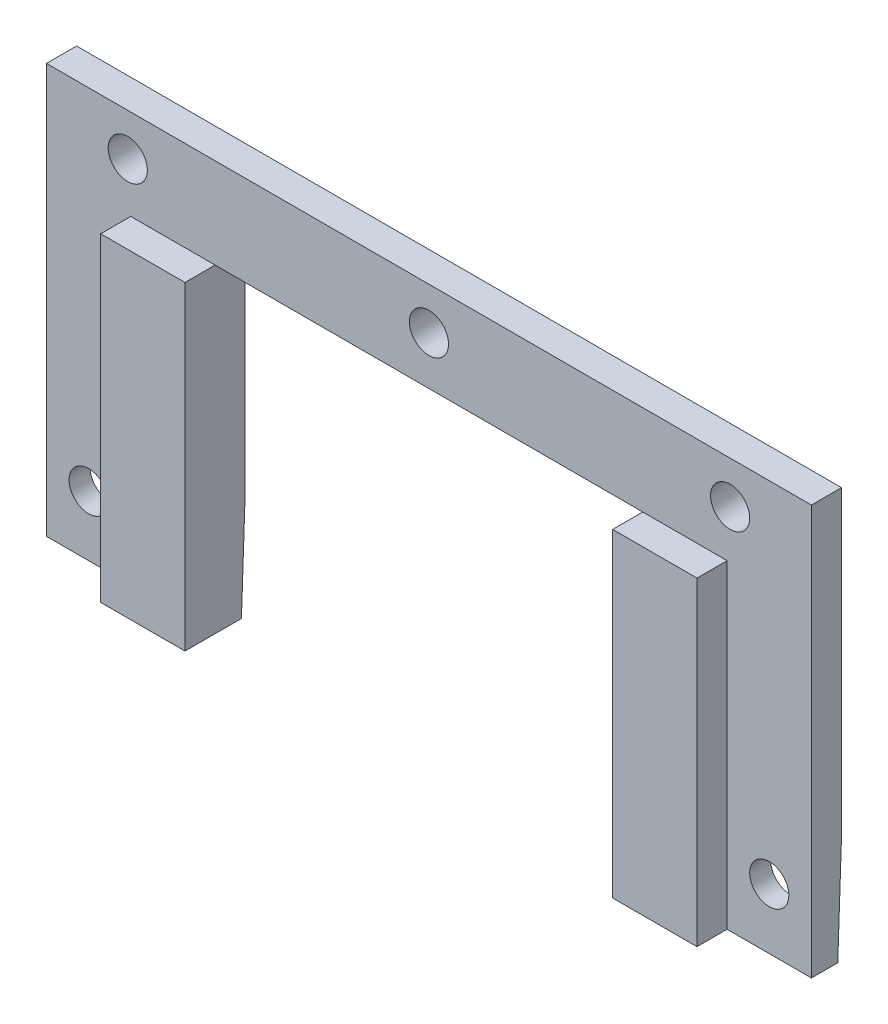
ISO-10303-21;
HEADER;
FILE_DESCRIPTION(('STEP AP214'),'2;1');
FILE_NAME('part.step','',(''),(''),'','','');
FILE_SCHEMA(('AUTOMOTIVE_DESIGN { 1 0 10303 214 1 1 1 1 }'));
ENDSEC;
DATA;
#1=APPLICATION_CONTEXT('core data for automotive mechanical design processes');
#2=APPLICATION_PROTOCOL_DEFINITION('international standard','automotive_design',2000,#1);
#3=PRODUCT_CONTEXT('',#1,'mechanical');
#4=PRODUCT('Part','Part','',(#3));
#5=PRODUCT_RELATED_PRODUCT_CATEGORY('part','',(#4));
#6=PRODUCT_DEFINITION_FORMATION('','',#4);
#7=PRODUCT_DEFINITION_CONTEXT('part definition',#1,'design');
#8=PRODUCT_DEFINITION('design','',#6,#7);
#9=PRODUCT_DEFINITION_SHAPE('','',#8);
#10=(LENGTH_UNIT() NAMED_UNIT(*) SI_UNIT(.MILLI.,.METRE.));
#11=(NAMED_UNIT(*) PLANE_ANGLE_UNIT() SI_UNIT($,.RADIAN.));
#12=(NAMED_UNIT(*) SI_UNIT($,.STERADIAN.) SOLID_ANGLE_UNIT());
#13=UNCERTAINTY_MEASURE_WITH_UNIT(LENGTH_MEASURE(1.E-05),#10,'distance_accuracy_value','');
#14=(GEOMETRIC_REPRESENTATION_CONTEXT(3) GLOBAL_UNCERTAINTY_ASSIGNED_CONTEXT((#13)) GLOBAL_UNIT_ASSIGNED_CONTEXT((#10,
#11,#12)) REPRESENTATION_CONTEXT('',''));
#15=CARTESIAN_POINT('',(0.,0.,0.));
#16=DIRECTION('',(0.,0.,1.));
#17=DIRECTION('',(1.,0.,0.));
#18=AXIS2_PLACEMENT_3D('',#15,#16,#17);
#19=CARTESIAN_POINT('',(0.,0.,5.));
#20=DIRECTION('',(0.,0.,-1.));
#21=DIRECTION('',(-1.,0.,0.));
#22=AXIS2_PLACEMENT_3D('',#19,#20,#21);
#23=PLANE('',#22);
#24=CARTESIAN_POINT('',(56.5,57.,5.));
#25=DIRECTION('',(0.,0.,-1.));
#26=DIRECTION('',(-1.,0.,0.));
#27=AXIS2_PLACEMENT_3D('',#24,#25,#26);
#28=CIRCLE('',#27,3.25);
#29=CARTESIAN_POINT('',(53.25,57.,5.));
#30=VERTEX_POINT('',#29);
#31=EDGE_CURVE('E190',#30,#30,#28,.F.);
#32=ORIENTED_EDGE('',*,*,#31,.F.);
#33=EDGE_LOOP('',(#32));
#34=FACE_BOUND('',#33,.T.);
#35=CARTESIAN_POINT('',(-56.5,57.,5.));
#36=DIRECTION('',(0.,0.,-1.));
#37=DIRECTION('',(-1.,0.,0.));
#38=AXIS2_PLACEMENT_3D('',#35,#36,#37);
#39=CIRCLE('',#38,3.25);
#40=CARTESIAN_POINT('',(-59.75,57.,5.));
#41=VERTEX_POINT('',#40);
#42=EDGE_CURVE('E182',#41,#41,#39,.F.);
#43=ORIENTED_EDGE('',*,*,#42,.F.);
#44=EDGE_LOOP('',(#43));
#45=FACE_BOUND('',#44,.T.);
#46=CARTESIAN_POINT('',(0.,108.,5.));
#47=DIRECTION('',(0.,0.,1.));
#48=DIRECTION('',(1.,0.,0.));
#49=AXIS2_PLACEMENT_3D('',#46,#47,#48);
#50=CIRCLE('',#49,3.25);
#51=CARTESIAN_POINT('',(3.25,108.,5.));
#52=VERTEX_POINT('',#51);
#53=EDGE_CURVE('E269',#52,#52,#50,.T.);
#54=ORIENTED_EDGE('',*,*,#53,.F.);
#55=EDGE_LOOP('',(#54));
#56=FACE_BOUND('',#55,.T.);
#57=CARTESIAN_POINT('',(-50.,108.,5.));
#58=DIRECTION('',(0.,0.,1.));
#59=DIRECTION('',(1.,0.,0.));
#60=AXIS2_PLACEMENT_3D('',#57,#58,#59);
#61=CIRCLE('',#60,3.25);
#62=CARTESIAN_POINT('',(-46.75,108.,5.));
#63=VERTEX_POINT('',#62);
#64=EDGE_CURVE('E263',#63,#63,#61,.T.);
#65=ORIENTED_EDGE('',*,*,#64,.F.);
#66=EDGE_LOOP('',(#65));
#67=FACE_BOUND('',#66,.T.);
#68=CARTESIAN_POINT('',(50.,108.,5.));
#69=DIRECTION('',(0.,0.,1.));
#70=DIRECTION('',(1.,0.,0.));
#71=AXIS2_PLACEMENT_3D('',#68,#69,#70);
#72=CIRCLE('',#71,3.25);
#73=CARTESIAN_POINT('',(53.25,108.,5.));
#74=VERTEX_POINT('',#73);
#75=EDGE_CURVE('E257',#74,#74,#72,.T.);
#76=ORIENTED_EDGE('',*,*,#75,.F.);
#77=EDGE_LOOP('',(#76));
#78=FACE_BOUND('',#77,.T.);
#79=DIRECTION('',(0.,1.,0.));
#80=VECTOR('',#79,1.);
#81=CARTESIAN_POINT('',(49.5,47.,5.));
#82=LINE('',#81,#80);
#83=CARTESIAN_POINT('',(49.5,47.,5.));
#84=VERTEX_POINT('',#83);
#85=CARTESIAN_POINT('',(49.5,100.,5.));
#86=VERTEX_POINT('',#85);
#87=EDGE_CURVE('E207',#84,#86,#82,.T.);
#88=ORIENTED_EDGE('',*,*,#87,.F.);
#89=DIRECTION('',(1.,0.,0.));
#90=VECTOR('',#89,1.);
#91=CARTESIAN_POINT('',(63.5,47.,5.));
#92=LINE('',#91,#90);
#93=CARTESIAN_POINT('',(63.5,47.,5.));
#94=VERTEX_POINT('',#93);
#95=EDGE_CURVE('E280',#84,#94,#92,.T.);
#96=ORIENTED_EDGE('',*,*,#95,.T.);
#97=DIRECTION('',(0.,1.,0.));
#98=VECTOR('',#97,1.);
#99=CARTESIAN_POINT('',(63.5,115.,5.));
#100=LINE('',#99,#98);
#101=CARTESIAN_POINT('',(63.5,115.,5.));
#102=VERTEX_POINT('',#101);
#103=EDGE_CURVE('E161',#94,#102,#100,.T.);
#104=ORIENTED_EDGE('',*,*,#103,.T.);
#105=DIRECTION('',(-1.,0.,0.));
#106=VECTOR('',#105,1.);
#107=CARTESIAN_POINT('',(-63.5,115.,5.));
#108=LINE('',#107,#106);
#109=CARTESIAN_POINT('',(-63.5,115.,5.));
#110=VERTEX_POINT('',#109);
#111=EDGE_CURVE('E283',#102,#110,#108,.T.);
#112=ORIENTED_EDGE('',*,*,#111,.T.);
#113=DIRECTION('',(0.,-1.,0.));
#114=VECTOR('',#113,1.);
#115=CARTESIAN_POINT('',(-63.5,47.,5.));
#116=LINE('',#115,#114);
#117=CARTESIAN_POINT('',(-63.5,47.,5.));
#118=VERTEX_POINT('',#117);
#119=EDGE_CURVE('E285',#110,#118,#116,.T.);
#120=ORIENTED_EDGE('',*,*,#119,.T.);
#121=DIRECTION('',(1.,0.,0.));
#122=VECTOR('',#121,1.);
#123=CARTESIAN_POINT('',(-35.5,47.,5.));
#124=LINE('',#123,#122);
#125=CARTESIAN_POINT('',(-49.5,47.,5.));
#126=VERTEX_POINT('',#125);
#127=EDGE_CURVE('E275',#118,#126,#124,.T.);
#128=ORIENTED_EDGE('',*,*,#127,.T.);
#129=DIRECTION('',(0.,-1.,0.));
#130=VECTOR('',#129,1.);
#131=CARTESIAN_POINT('',(-49.5,47.,5.));
#132=LINE('',#131,#130);
#133=CARTESIAN_POINT('',(-49.5,100.,5.));
#134=VERTEX_POINT('',#133);
#135=EDGE_CURVE('E231',#134,#126,#132,.T.);
#136=ORIENTED_EDGE('',*,*,#135,.F.);
#137=DIRECTION('',(-1.,0.,0.));
#138=VECTOR('',#137,1.);
#139=CARTESIAN_POINT('',(-49.5,100.,5.));
#140=LINE('',#139,#138);
#141=CARTESIAN_POINT('',(-35.5,100.,5.));
#142=VERTEX_POINT('',#141);
#143=EDGE_CURVE('E236',#142,#134,#140,.T.);
#144=ORIENTED_EDGE('',*,*,#143,.F.);
#145=DIRECTION('',(1.,0.,0.));
#146=VECTOR('',#145,1.);
#147=CARTESIAN_POINT('',(35.5,100.,5.));
#148=LINE('',#147,#146);
#149=CARTESIAN_POINT('',(35.5,100.,5.));
#150=VERTEX_POINT('',#149);
#151=EDGE_CURVE('E277',#142,#150,#148,.T.);
#152=ORIENTED_EDGE('',*,*,#151,.T.);
#153=DIRECTION('',(-1.,0.,0.));
#154=VECTOR('',#153,1.);
#155=CARTESIAN_POINT('',(35.5,100.,5.));
#156=LINE('',#155,#154);
#157=EDGE_CURVE('E212',#86,#150,#156,.T.);
#158=ORIENTED_EDGE('',*,*,#157,.F.);
#159=EDGE_LOOP('',(#88,#96,#104,#112,#120,#128,#136,#144,#152,#158));
#160=FACE_BOUND('',#159,.T.);
#161=ADVANCED_FACE('F33',(#34,#45,#56,#67,#78,#160),#23,.F.);
#162=CARTESIAN_POINT('',(0.,0.,0.));
#163=DIRECTION('',(0.,0.,-1.));
#164=DIRECTION('',(-1.,0.,0.));
#165=AXIS2_PLACEMENT_3D('',#162,#163,#164);
#166=PLANE('',#165);
#167=DIRECTION('',(1.,0.,0.));
#168=VECTOR('',#167,1.);
#169=CARTESIAN_POINT('',(-63.5,65.,0.));
#170=LINE('',#169,#168);
#171=CARTESIAN_POINT('',(-63.5,65.,0.));
#172=VERTEX_POINT('',#171);
#173=CARTESIAN_POINT('',(-35.5,65.,0.));
#174=VERTEX_POINT('',#173);
#175=EDGE_CURVE('E200',#172,#174,#170,.T.);
#176=ORIENTED_EDGE('',*,*,#175,.F.);
#177=DIRECTION('',(0.,-1.,0.));
#178=VECTOR('',#177,1.);
#179=CARTESIAN_POINT('',(-63.5,47.,0.));
#180=LINE('',#179,#178);
#181=CARTESIAN_POINT('',(-63.5,115.,0.));
#182=VERTEX_POINT('',#181);
#183=EDGE_CURVE('E278',#182,#172,#180,.T.);
#184=ORIENTED_EDGE('',*,*,#183,.F.);
#185=DIRECTION('',(-1.,0.,0.));
#186=VECTOR('',#185,1.);
#187=CARTESIAN_POINT('',(-63.5,115.,0.));
#188=LINE('',#187,#186);
#189=CARTESIAN_POINT('',(63.5,115.,0.));
#190=VERTEX_POINT('',#189);
#191=EDGE_CURVE('E296',#190,#182,#188,.T.);
#192=ORIENTED_EDGE('',*,*,#191,.F.);
#193=DIRECTION('',(0.,1.,0.));
#194=VECTOR('',#193,1.);
#195=CARTESIAN_POINT('',(63.5,115.,0.));
#196=LINE('',#195,#194);
#197=CARTESIAN_POINT('',(63.5,65.,0.));
#198=VERTEX_POINT('',#197);
#199=EDGE_CURVE('E294',#198,#190,#196,.T.);
#200=ORIENTED_EDGE('',*,*,#199,.F.);
#201=CARTESIAN_POINT('',(35.5,65.,0.));
#202=VERTEX_POINT('',#201);
#203=EDGE_CURVE('E50',#202,#198,#170,.T.);
#204=ORIENTED_EDGE('',*,*,#203,.F.);
#205=DIRECTION('',(0.,-1.,0.));
#206=VECTOR('',#205,1.);
#207=CARTESIAN_POINT('',(35.5,47.,0.));
#208=LINE('',#207,#206);
#209=CARTESIAN_POINT('',(35.5,100.,0.));
#210=VERTEX_POINT('',#209);
#211=EDGE_CURVE('E291',#210,#202,#208,.T.);
#212=ORIENTED_EDGE('',*,*,#211,.F.);
#213=DIRECTION('',(1.,0.,0.));
#214=VECTOR('',#213,1.);
#215=CARTESIAN_POINT('',(35.5,100.,0.));
#216=LINE('',#215,#214);
#217=CARTESIAN_POINT('',(-35.5,100.,0.));
#218=VERTEX_POINT('',#217);
#219=EDGE_CURVE('E289',#218,#210,#216,.T.);
#220=ORIENTED_EDGE('',*,*,#219,.F.);
#221=DIRECTION('',(0.,1.,0.));
#222=VECTOR('',#221,1.);
#223=CARTESIAN_POINT('',(-35.5,100.,0.));
#224=LINE('',#223,#222);
#225=EDGE_CURVE('E272',#174,#218,#224,.T.);
#226=ORIENTED_EDGE('',*,*,#225,.F.);
#227=EDGE_LOOP('',(#176,#184,#192,#200,#204,#212,#220,#226));
#228=FACE_BOUND('',#227,.T.);
#229=CARTESIAN_POINT('',(-50.,108.,0.));
#230=DIRECTION('',(0.,0.,1.));
#231=DIRECTION('',(1.,0.,0.));
#232=AXIS2_PLACEMENT_3D('',#229,#230,#231);
#233=CIRCLE('',#232,3.25);
#234=CARTESIAN_POINT('',(-46.75,108.,0.));
#235=VERTEX_POINT('',#234);
#236=EDGE_CURVE('E260',#235,#235,#233,.T.);
#237=ORIENTED_EDGE('',*,*,#236,.T.);
#238=EDGE_LOOP('',(#237));
#239=FACE_BOUND('',#238,.T.);
#240=CARTESIAN_POINT('',(0.,108.,0.));
#241=DIRECTION('',(0.,0.,1.));
#242=DIRECTION('',(1.,0.,0.));
#243=AXIS2_PLACEMENT_3D('',#240,#241,#242);
#244=CIRCLE('',#243,3.25);
#245=CARTESIAN_POINT('',(3.25,108.,0.));
#246=VERTEX_POINT('',#245);
#247=EDGE_CURVE('E266',#246,#246,#244,.T.);
#248=ORIENTED_EDGE('',*,*,#247,.T.);
#249=EDGE_LOOP('',(#248));
#250=FACE_BOUND('',#249,.T.);
#251=CARTESIAN_POINT('',(50.,108.,0.));
#252=DIRECTION('',(0.,0.,1.));
#253=DIRECTION('',(1.,0.,0.));
#254=AXIS2_PLACEMENT_3D('',#251,#252,#253);
#255=CIRCLE('',#254,3.25);
#256=CARTESIAN_POINT('',(53.25,108.,0.));
#257=VERTEX_POINT('',#256);
#258=EDGE_CURVE('E256',#257,#257,#255,.T.);
#259=ORIENTED_EDGE('',*,*,#258,.T.);
#260=EDGE_LOOP('',(#259));
#261=FACE_BOUND('',#260,.T.);
#262=ADVANCED_FACE('F313',(#228,#239,#250,#261),#166,.T.);
#263=CARTESIAN_POINT('',(-35.5,47.,5.));
#264=DIRECTION('',(0.,1.,0.));
#265=DIRECTION('',(0.,0.,1.));
#266=AXIS2_PLACEMENT_3D('',#263,#264,#265);
#267=PLANE('',#266);
#268=DIRECTION('',(0.,0.,-1.));
#269=VECTOR('',#268,1.);
#270=CARTESIAN_POINT('',(-63.5,47.,5.));
#271=LINE('',#270,#269);
#272=CARTESIAN_POINT('',(-63.5,47.,0.628573850851329));
#273=VERTEX_POINT('',#272);
#274=EDGE_CURVE('E287',#118,#273,#271,.T.);
#275=ORIENTED_EDGE('',*,*,#274,.T.);
#276=DIRECTION('',(1.,0.,0.));
#277=VECTOR('',#276,1.);
#278=CARTESIAN_POINT('',(-63.5,47.,0.628573850851329));
#279=LINE('',#278,#277);
#280=CARTESIAN_POINT('',(-35.5,47.,0.628573850851329));
#281=VERTEX_POINT('',#280);
#282=EDGE_CURVE('E58',#273,#281,#279,.T.);
#283=ORIENTED_EDGE('',*,*,#282,.T.);
#284=DIRECTION('',(0.,0.,-1.));
#285=VECTOR('',#284,1.);
#286=CARTESIAN_POINT('',(-35.5,47.,5.));
#287=LINE('',#286,#285);
#288=CARTESIAN_POINT('',(-35.5,47.,10.));
#289=VERTEX_POINT('',#288);
#290=EDGE_CURVE('E11',#289,#281,#287,.T.);
#291=ORIENTED_EDGE('',*,*,#290,.F.);
#292=DIRECTION('',(1.,0.,0.));
#293=VECTOR('',#292,1.);
#294=CARTESIAN_POINT('',(-49.5,47.,10.));
#295=LINE('',#294,#293);
#296=CARTESIAN_POINT('',(-49.5,47.,10.));
#297=VERTEX_POINT('',#296);
#298=EDGE_CURVE('E235',#297,#289,#295,.T.);
#299=ORIENTED_EDGE('',*,*,#298,.F.);
#300=DIRECTION('',(0.,0.,-1.));
#301=VECTOR('',#300,1.);
#302=CARTESIAN_POINT('',(-49.5,47.,10.));
#303=LINE('',#302,#301);
#304=EDGE_CURVE('E253',#297,#126,#303,.T.);
#305=ORIENTED_EDGE('',*,*,#304,.T.);
#306=ORIENTED_EDGE('',*,*,#127,.F.);
#307=EDGE_LOOP('',(#275,#283,#291,#299,#305,#306));
#308=FACE_BOUND('',#307,.T.);
#309=ADVANCED_FACE('F35',(#308),#267,.F.);
#310=CARTESIAN_POINT('',(-35.5,100.,5.));
#311=DIRECTION('',(-1.,0.,0.));
#312=DIRECTION('',(0.,-1.,0.));
#313=AXIS2_PLACEMENT_3D('',#310,#311,#312);
#314=PLANE('',#313);
#315=ORIENTED_EDGE('',*,*,#290,.T.);
#316=DIRECTION('',(0.,0.999390827019096,-0.0348994967024938));
#317=VECTOR('',#316,1.);
#318=CARTESIAN_POINT('',(-35.5,99.7829796951867,-1.2146484161715));
#319=LINE('',#318,#317);
#320=EDGE_CURVE('E204',#281,#174,#319,.T.);
#321=ORIENTED_EDGE('',*,*,#320,.T.);
#322=ORIENTED_EDGE('',*,*,#225,.T.);
#323=DIRECTION('',(0.,0.,-1.));
#324=VECTOR('',#323,1.);
#325=CARTESIAN_POINT('',(-35.5,100.,5.));
#326=LINE('',#325,#324);
#327=EDGE_CURVE('E42',#142,#218,#326,.T.);
#328=ORIENTED_EDGE('',*,*,#327,.F.);
#329=DIRECTION('',(0.,0.,-1.));
#330=VECTOR('',#329,1.);
#331=CARTESIAN_POINT('',(-35.5,100.,10.));
#332=LINE('',#331,#330);
#333=CARTESIAN_POINT('',(-35.5,100.,10.));
#334=VERTEX_POINT('',#333);
#335=EDGE_CURVE('E250',#334,#142,#332,.T.);
#336=ORIENTED_EDGE('',*,*,#335,.F.);
#337=DIRECTION('',(0.,1.,0.));
#338=VECTOR('',#337,1.);
#339=CARTESIAN_POINT('',(-35.5,47.,10.));
#340=LINE('',#339,#338);
#341=EDGE_CURVE('E239',#289,#334,#340,.T.);
#342=ORIENTED_EDGE('',*,*,#341,.F.);
#343=EDGE_LOOP('',(#315,#321,#322,#328,#336,#342));
#344=FACE_BOUND('',#343,.T.);
#345=ADVANCED_FACE('F319',(#344),#314,.F.);
#346=CARTESIAN_POINT('',(35.5,100.,5.));
#347=DIRECTION('',(0.,1.,0.));
#348=DIRECTION('',(0.,0.,1.));
#349=AXIS2_PLACEMENT_3D('',#346,#347,#348);
#350=PLANE('',#349);
#351=ORIENTED_EDGE('',*,*,#219,.T.);
#352=DIRECTION('',(0.,0.,-1.));
#353=VECTOR('',#352,1.);
#354=CARTESIAN_POINT('',(35.5,100.,5.));
#355=LINE('',#354,#353);
#356=EDGE_CURVE('E164',#150,#210,#355,.T.);
#357=ORIENTED_EDGE('',*,*,#356,.F.);
#358=ORIENTED_EDGE('',*,*,#151,.F.);
#359=ORIENTED_EDGE('',*,*,#327,.T.);
#360=EDGE_LOOP('',(#351,#357,#358,#359));
#361=FACE_BOUND('',#360,.T.);
#362=ADVANCED_FACE('F344',(#361),#350,.F.);
#363=CARTESIAN_POINT('',(35.5,47.,5.));
#364=DIRECTION('',(1.,0.,0.));
#365=DIRECTION('',(0.,1.,0.));
#366=AXIS2_PLACEMENT_3D('',#363,#364,#365);
#367=PLANE('',#366);
#368=ORIENTED_EDGE('',*,*,#211,.T.);
#369=DIRECTION('',(0.,-0.999390827019096,0.0348994967024938));
#370=VECTOR('',#369,1.);
#371=CARTESIAN_POINT('',(35.5,46.8475323633013,0.633898138047435));
#372=LINE('',#371,#370);
#373=CARTESIAN_POINT('',(35.5,47.,0.628573850851329));
#374=VERTEX_POINT('',#373);
#375=EDGE_CURVE('E201',#202,#374,#372,.T.);
#376=ORIENTED_EDGE('',*,*,#375,.T.);
#377=DIRECTION('',(0.,0.,-1.));
#378=VECTOR('',#377,1.);
#379=CARTESIAN_POINT('',(35.5,47.,5.));
#380=LINE('',#379,#378);
#381=CARTESIAN_POINT('',(35.5,47.,10.));
#382=VERTEX_POINT('',#381);
#383=EDGE_CURVE('E157',#382,#374,#380,.T.);
#384=ORIENTED_EDGE('',*,*,#383,.F.);
#385=DIRECTION('',(0.,-1.,0.));
#386=VECTOR('',#385,1.);
#387=CARTESIAN_POINT('',(35.5,47.,10.));
#388=LINE('',#387,#386);
#389=CARTESIAN_POINT('',(35.5,100.,10.));
#390=VERTEX_POINT('',#389);
#391=EDGE_CURVE('E208',#390,#382,#388,.T.);
#392=ORIENTED_EDGE('',*,*,#391,.F.);
#393=DIRECTION('',(0.,0.,-1.));
#394=VECTOR('',#393,1.);
#395=CARTESIAN_POINT('',(35.5,100.,10.));
#396=LINE('',#395,#394);
#397=EDGE_CURVE('E218',#390,#150,#396,.T.);
#398=ORIENTED_EDGE('',*,*,#397,.T.);
#399=ORIENTED_EDGE('',*,*,#356,.T.);
#400=EDGE_LOOP('',(#368,#376,#384,#392,#398,#399));
#401=FACE_BOUND('',#400,.T.);
#402=ADVANCED_FACE('F338',(#401),#367,.F.);
#403=CARTESIAN_POINT('',(63.5,47.,5.));
#404=DIRECTION('',(0.,1.,0.));
#405=DIRECTION('',(0.,0.,1.));
#406=AXIS2_PLACEMENT_3D('',#403,#404,#405);
#407=PLANE('',#406);
#408=ORIENTED_EDGE('',*,*,#383,.T.);
#409=CARTESIAN_POINT('',(63.5,47.,0.628573850851329));
#410=VERTEX_POINT('',#409);
#411=EDGE_CURVE('E142',#374,#410,#279,.T.);
#412=ORIENTED_EDGE('',*,*,#411,.T.);
#413=DIRECTION('',(0.,0.,-1.));
#414=VECTOR('',#413,1.);
#415=CARTESIAN_POINT('',(63.5,47.,5.));
#416=LINE('',#415,#414);
#417=EDGE_CURVE('E154',#94,#410,#416,.T.);
#418=ORIENTED_EDGE('',*,*,#417,.F.);
#419=ORIENTED_EDGE('',*,*,#95,.F.);
#420=DIRECTION('',(0.,0.,-1.));
#421=VECTOR('',#420,1.);
#422=CARTESIAN_POINT('',(49.5,47.,10.));
#423=LINE('',#422,#421);
#424=CARTESIAN_POINT('',(49.5,47.,10.));
#425=VERTEX_POINT('',#424);
#426=EDGE_CURVE('E228',#425,#84,#423,.T.);
#427=ORIENTED_EDGE('',*,*,#426,.F.);
#428=DIRECTION('',(1.,0.,0.));
#429=VECTOR('',#428,1.);
#430=CARTESIAN_POINT('',(35.5,47.,10.));
#431=LINE('',#430,#429);
#432=EDGE_CURVE('E211',#382,#425,#431,.T.);
#433=ORIENTED_EDGE('',*,*,#432,.F.);
#434=EDGE_LOOP('',(#408,#412,#418,#419,#427,#433));
#435=FACE_BOUND('',#434,.T.);
#436=ADVANCED_FACE('F153',(#435),#407,.F.);
#437=CARTESIAN_POINT('',(63.5,115.,5.));
#438=DIRECTION('',(-1.,0.,0.));
#439=DIRECTION('',(0.,0.,1.));
#440=AXIS2_PLACEMENT_3D('',#437,#438,#439);
#441=PLANE('',#440);
#442=ORIENTED_EDGE('',*,*,#417,.T.);
#443=DIRECTION('',(0.,-0.999390827019096,0.0348994967024938));
#444=VECTOR('',#443,1.);
#445=CARTESIAN_POINT('',(63.5,65.,0.));
#446=LINE('',#445,#444);
#447=EDGE_CURVE('E139',#198,#410,#446,.T.);
#448=ORIENTED_EDGE('',*,*,#447,.F.);
#449=ORIENTED_EDGE('',*,*,#199,.T.);
#450=DIRECTION('',(0.,0.,-1.));
#451=VECTOR('',#450,1.);
#452=CARTESIAN_POINT('',(63.5,115.,5.));
#453=LINE('',#452,#451);
#454=EDGE_CURVE('E162',#102,#190,#453,.T.);
#455=ORIENTED_EDGE('',*,*,#454,.F.);
#456=ORIENTED_EDGE('',*,*,#103,.F.);
#457=EDGE_LOOP('',(#442,#448,#449,#455,#456));
#458=FACE_BOUND('',#457,.T.);
#459=ADVANCED_FACE('F159',(#458),#441,.F.);
#460=CARTESIAN_POINT('',(-63.5,115.,5.));
#461=DIRECTION('',(0.,-1.,0.));
#462=DIRECTION('',(0.,0.,-1.));
#463=AXIS2_PLACEMENT_3D('',#460,#461,#462);
#464=PLANE('',#463);
#465=ORIENTED_EDGE('',*,*,#191,.T.);
#466=DIRECTION('',(0.,0.,-1.));
#467=VECTOR('',#466,1.);
#468=CARTESIAN_POINT('',(-63.5,115.,5.));
#469=LINE('',#468,#467);
#470=EDGE_CURVE('E167',#110,#182,#469,.T.);
#471=ORIENTED_EDGE('',*,*,#470,.F.);
#472=ORIENTED_EDGE('',*,*,#111,.F.);
#473=ORIENTED_EDGE('',*,*,#454,.T.);
#474=EDGE_LOOP('',(#465,#471,#472,#473));
#475=FACE_BOUND('',#474,.T.);
#476=ADVANCED_FACE('F335',(#475),#464,.F.);
#477=CARTESIAN_POINT('',(-63.5,47.,5.));
#478=DIRECTION('',(1.,0.,0.));
#479=DIRECTION('',(0.,0.,-1.));
#480=AXIS2_PLACEMENT_3D('',#477,#478,#479);
#481=PLANE('',#480);
#482=ORIENTED_EDGE('',*,*,#183,.T.);
#483=DIRECTION('',(0.,-0.999390827019096,0.0348994967024938));
#484=VECTOR('',#483,1.);
#485=CARTESIAN_POINT('',(-63.5,65.,0.));
#486=LINE('',#485,#484);
#487=EDGE_CURVE('E147',#172,#273,#486,.T.);
#488=ORIENTED_EDGE('',*,*,#487,.T.);
#489=ORIENTED_EDGE('',*,*,#274,.F.);
#490=ORIENTED_EDGE('',*,*,#119,.F.);
#491=ORIENTED_EDGE('',*,*,#470,.T.);
#492=EDGE_LOOP('',(#482,#488,#489,#490,#491));
#493=FACE_BOUND('',#492,.T.);
#494=ADVANCED_FACE('F306',(#493),#481,.F.);
#495=CARTESIAN_POINT('',(0.,108.,5.));
#496=DIRECTION('',(0.,0.,-1.));
#497=DIRECTION('',(-1.,0.,0.));
#498=AXIS2_PLACEMENT_3D('',#495,#496,#497);
#499=CYLINDRICAL_SURFACE('',#498,3.25);
#500=ORIENTED_EDGE('',*,*,#53,.T.);
#501=EDGE_LOOP('',(#500));
#502=FACE_BOUND('',#501,.T.);
#503=ORIENTED_EDGE('',*,*,#247,.F.);
#504=EDGE_LOOP('',(#503));
#505=FACE_BOUND('',#504,.T.);
#506=ADVANCED_FACE('F374',(#502,#505),#499,.F.);
#507=CARTESIAN_POINT('',(-50.,108.,5.));
#508=DIRECTION('',(0.,0.,-1.));
#509=DIRECTION('',(-1.,0.,0.));
#510=AXIS2_PLACEMENT_3D('',#507,#508,#509);
#511=CYLINDRICAL_SURFACE('',#510,3.25);
#512=ORIENTED_EDGE('',*,*,#64,.T.);
#513=EDGE_LOOP('',(#512));
#514=FACE_BOUND('',#513,.T.);
#515=ORIENTED_EDGE('',*,*,#236,.F.);
#516=EDGE_LOOP('',(#515));
#517=FACE_BOUND('',#516,.T.);
#518=ADVANCED_FACE('F463',(#514,#517),#511,.F.);
#519=CARTESIAN_POINT('',(50.,108.,5.));
#520=DIRECTION('',(0.,0.,-1.));
#521=DIRECTION('',(-1.,0.,0.));
#522=AXIS2_PLACEMENT_3D('',#519,#520,#521);
#523=CYLINDRICAL_SURFACE('',#522,3.25);
#524=ORIENTED_EDGE('',*,*,#75,.T.);
#525=EDGE_LOOP('',(#524));
#526=FACE_BOUND('',#525,.T.);
#527=ORIENTED_EDGE('',*,*,#258,.F.);
#528=EDGE_LOOP('',(#527));
#529=FACE_BOUND('',#528,.T.);
#530=ADVANCED_FACE('F445',(#526,#529),#523,.F.);
#531=CARTESIAN_POINT('',(-49.5,47.,10.));
#532=DIRECTION('',(1.,0.,0.));
#533=DIRECTION('',(0.,0.,-1.));
#534=AXIS2_PLACEMENT_3D('',#531,#532,#533);
#535=PLANE('',#534);
#536=ORIENTED_EDGE('',*,*,#135,.T.);
#537=ORIENTED_EDGE('',*,*,#304,.F.);
#538=DIRECTION('',(0.,-1.,0.));
#539=VECTOR('',#538,1.);
#540=CARTESIAN_POINT('',(-49.5,47.,10.));
#541=LINE('',#540,#539);
#542=CARTESIAN_POINT('',(-49.5,100.,10.));
#543=VERTEX_POINT('',#542);
#544=EDGE_CURVE('E232',#543,#297,#541,.T.);
#545=ORIENTED_EDGE('',*,*,#544,.F.);
#546=DIRECTION('',(0.,0.,-1.));
#547=VECTOR('',#546,1.);
#548=CARTESIAN_POINT('',(-49.5,100.,10.));
#549=LINE('',#548,#547);
#550=EDGE_CURVE('E243',#543,#134,#549,.T.);
#551=ORIENTED_EDGE('',*,*,#550,.T.);
#552=EDGE_LOOP('',(#536,#537,#545,#551));
#553=FACE_BOUND('',#552,.T.);
#554=ADVANCED_FACE('F331',(#553),#535,.F.);
#555=CARTESIAN_POINT('',(-49.5,100.,10.));
#556=DIRECTION('',(0.,-1.,0.));
#557=DIRECTION('',(1.,0.,0.));
#558=AXIS2_PLACEMENT_3D('',#555,#556,#557);
#559=PLANE('',#558);
#560=ORIENTED_EDGE('',*,*,#143,.T.);
#561=ORIENTED_EDGE('',*,*,#550,.F.);
#562=DIRECTION('',(-1.,0.,0.));
#563=VECTOR('',#562,1.);
#564=CARTESIAN_POINT('',(-49.5,100.,10.));
#565=LINE('',#564,#563);
#566=EDGE_CURVE('E241',#334,#543,#565,.T.);
#567=ORIENTED_EDGE('',*,*,#566,.F.);
#568=ORIENTED_EDGE('',*,*,#335,.T.);
#569=EDGE_LOOP('',(#560,#561,#567,#568));
#570=FACE_BOUND('',#569,.T.);
#571=ADVANCED_FACE('F427',(#570),#559,.F.);
#572=CARTESIAN_POINT('',(0.,0.,10.));
#573=DIRECTION('',(0.,0.,-1.));
#574=DIRECTION('',(-1.,0.,0.));
#575=AXIS2_PLACEMENT_3D('',#572,#573,#574);
#576=PLANE('',#575);
#577=ORIENTED_EDGE('',*,*,#544,.T.);
#578=ORIENTED_EDGE('',*,*,#298,.T.);
#579=ORIENTED_EDGE('',*,*,#341,.T.);
#580=ORIENTED_EDGE('',*,*,#566,.T.);
#581=EDGE_LOOP('',(#577,#578,#579,#580));
#582=FACE_BOUND('',#581,.T.);
#583=ADVANCED_FACE('F325',(#582),#576,.F.);
#584=CARTESIAN_POINT('',(49.5,47.,10.));
#585=DIRECTION('',(-1.,0.,0.));
#586=DIRECTION('',(0.,0.,1.));
#587=AXIS2_PLACEMENT_3D('',#584,#585,#586);
#588=PLANE('',#587);
#589=ORIENTED_EDGE('',*,*,#87,.T.);
#590=DIRECTION('',(0.,0.,-1.));
#591=VECTOR('',#590,1.);
#592=CARTESIAN_POINT('',(49.5,100.,10.));
#593=LINE('',#592,#591);
#594=CARTESIAN_POINT('',(49.5,100.,10.));
#595=VERTEX_POINT('',#594);
#596=EDGE_CURVE('E225',#595,#86,#593,.T.);
#597=ORIENTED_EDGE('',*,*,#596,.F.);
#598=DIRECTION('',(0.,1.,0.));
#599=VECTOR('',#598,1.);
#600=CARTESIAN_POINT('',(49.5,47.,10.));
#601=LINE('',#600,#599);
#602=EDGE_CURVE('E214',#425,#595,#601,.T.);
#603=ORIENTED_EDGE('',*,*,#602,.F.);
#604=ORIENTED_EDGE('',*,*,#426,.T.);
#605=EDGE_LOOP('',(#589,#597,#603,#604));
#606=FACE_BOUND('',#605,.T.);
#607=ADVANCED_FACE('F350',(#606),#588,.F.);
#608=CARTESIAN_POINT('',(35.5,100.,10.));
#609=DIRECTION('',(0.,-1.,0.));
#610=DIRECTION('',(1.,0.,0.));
#611=AXIS2_PLACEMENT_3D('',#608,#609,#610);
#612=PLANE('',#611);
#613=ORIENTED_EDGE('',*,*,#157,.T.);
#614=ORIENTED_EDGE('',*,*,#397,.F.);
#615=DIRECTION('',(-1.,0.,0.));
#616=VECTOR('',#615,1.);
#617=CARTESIAN_POINT('',(35.5,100.,10.));
#618=LINE('',#617,#616);
#619=EDGE_CURVE('E216',#595,#390,#618,.T.);
#620=ORIENTED_EDGE('',*,*,#619,.F.);
#621=ORIENTED_EDGE('',*,*,#596,.T.);
#622=EDGE_LOOP('',(#613,#614,#620,#621));
#623=FACE_BOUND('',#622,.T.);
#624=ADVANCED_FACE('F346',(#623),#612,.F.);
#625=CARTESIAN_POINT('',(0.,0.,10.));
#626=DIRECTION('',(0.,0.,-1.));
#627=DIRECTION('',(-1.,0.,0.));
#628=AXIS2_PLACEMENT_3D('',#625,#626,#627);
#629=PLANE('',#628);
#630=ORIENTED_EDGE('',*,*,#391,.T.);
#631=ORIENTED_EDGE('',*,*,#432,.T.);
#632=ORIENTED_EDGE('',*,*,#602,.T.);
#633=ORIENTED_EDGE('',*,*,#619,.T.);
#634=EDGE_LOOP('',(#630,#631,#632,#633));
#635=FACE_BOUND('',#634,.T.);
#636=ADVANCED_FACE('F354',(#635),#629,.F.);
#637=CARTESIAN_POINT('',(-63.5,65.,0.));
#638=DIRECTION('',(0.,0.0348994967024938,0.999390827019096));
#639=DIRECTION('',(0.,-0.999390827019096,0.0348994967024938));
#640=AXIS2_PLACEMENT_3D('',#637,#638,#639);
#641=PLANE('',#640);
#642=CARTESIAN_POINT('',(-56.5,57.,0.279366155933924));
#643=DIRECTION('',(0.,0.0348994967024938,0.999390827019096));
#644=DIRECTION('',(0.,0.999390827019096,-0.0348994967024938));
#645=AXIS2_PLACEMENT_3D('',#642,#643,#644);
#646=ELLIPSE('',#645,6.50396203794233,6.49999999999999);
#647=CARTESIAN_POINT('',(-56.5,63.5,0.0523811542376112));
#648=VERTEX_POINT('',#647);
#649=EDGE_CURVE('E148',#648,#648,#646,.F.);
#650=ORIENTED_EDGE('',*,*,#649,.F.);
#651=EDGE_LOOP('',(#650));
#652=FACE_BOUND('',#651,.T.);
#653=ORIENTED_EDGE('',*,*,#282,.F.);
#654=ORIENTED_EDGE('',*,*,#487,.F.);
#655=ORIENTED_EDGE('',*,*,#175,.T.);
#656=ORIENTED_EDGE('',*,*,#320,.F.);
#657=EDGE_LOOP('',(#653,#654,#655,#656));
#658=FACE_BOUND('',#657,.T.);
#659=ADVANCED_FACE('F317',(#652,#658),#641,.F.);
#660=CARTESIAN_POINT('',(56.5,57.,0.279366155933924));
#661=DIRECTION('',(0.,0.0348994967024938,0.999390827019096));
#662=DIRECTION('',(0.,0.999390827019096,-0.0348994967024938));
#663=AXIS2_PLACEMENT_3D('',#660,#661,#662);
#664=ELLIPSE('',#663,6.50396203794234,6.5);
#665=CARTESIAN_POINT('',(56.5,63.5,0.0523811542376112));
#666=VERTEX_POINT('',#665);
#667=EDGE_CURVE('E175',#666,#666,#664,.F.);
#668=ORIENTED_EDGE('',*,*,#667,.F.);
#669=EDGE_LOOP('',(#668));
#670=FACE_BOUND('',#669,.T.);
#671=ORIENTED_EDGE('',*,*,#203,.T.);
#672=ORIENTED_EDGE('',*,*,#447,.T.);
#673=ORIENTED_EDGE('',*,*,#411,.F.);
#674=ORIENTED_EDGE('',*,*,#375,.F.);
#675=EDGE_LOOP('',(#671,#672,#673,#674));
#676=FACE_BOUND('',#675,.T.);
#677=ADVANCED_FACE('F141',(#670,#676),#641,.F.);
#678=CARTESIAN_POINT('',(56.5,57.,1.5));
#679=DIRECTION('',(0.,0.,-1.));
#680=DIRECTION('',(-1.,0.,0.));
#681=AXIS2_PLACEMENT_3D('',#678,#679,#680);
#682=CYLINDRICAL_SURFACE('',#681,6.5);
#683=CARTESIAN_POINT('',(56.5,57.,1.5));
#684=DIRECTION('',(0.,0.,1.));
#685=DIRECTION('',(1.,0.,0.));
#686=AXIS2_PLACEMENT_3D('',#683,#684,#685);
#687=CIRCLE('',#686,6.5);
#688=CARTESIAN_POINT('',(63.,57.,1.5));
#689=VERTEX_POINT('',#688);
#690=EDGE_CURVE('E194',#689,#689,#687,.T.);
#691=ORIENTED_EDGE('',*,*,#690,.T.);
#692=EDGE_LOOP('',(#691));
#693=FACE_BOUND('',#692,.T.);
#694=ORIENTED_EDGE('',*,*,#667,.T.);
#695=EDGE_LOOP('',(#694));
#696=FACE_BOUND('',#695,.T.);
#697=ADVANCED_FACE('F512',(#693,#696),#682,.F.);
#698=CARTESIAN_POINT('',(56.5,57.,1.5));
#699=DIRECTION('',(0.,0.,1.));
#700=DIRECTION('',(1.,0.,0.));
#701=AXIS2_PLACEMENT_3D('',#698,#699,#700);
#702=PLANE('',#701);
#703=CARTESIAN_POINT('',(56.5,57.,1.5));
#704=DIRECTION('',(0.,0.,1.));
#705=DIRECTION('',(1.,0.,0.));
#706=AXIS2_PLACEMENT_3D('',#703,#704,#705);
#707=CIRCLE('',#706,3.25);
#708=CARTESIAN_POINT('',(59.75,57.,1.5));
#709=VERTEX_POINT('',#708);
#710=EDGE_CURVE('E37',#709,#709,#707,.F.);
#711=ORIENTED_EDGE('',*,*,#710,.F.);
#712=EDGE_LOOP('',(#711));
#713=FACE_BOUND('',#712,.T.);
#714=ORIENTED_EDGE('',*,*,#690,.F.);
#715=EDGE_LOOP('',(#714));
#716=FACE_BOUND('',#715,.T.);
#717=ADVANCED_FACE('F521',(#713,#716),#702,.F.);
#718=CARTESIAN_POINT('',(-56.5,57.,1.5));
#719=DIRECTION('',(0.,0.,-1.));
#720=DIRECTION('',(-1.,0.,0.));
#721=AXIS2_PLACEMENT_3D('',#718,#719,#720);
#722=CYLINDRICAL_SURFACE('',#721,6.49999999999999);
#723=CARTESIAN_POINT('',(-56.5,57.,1.5));
#724=DIRECTION('',(0.,0.,1.));
#725=DIRECTION('',(1.,0.,0.));
#726=AXIS2_PLACEMENT_3D('',#723,#724,#725);
#727=CIRCLE('',#726,6.49999999999999);
#728=CARTESIAN_POINT('',(-50.,57.,1.5));
#729=VERTEX_POINT('',#728);
#730=EDGE_CURVE('E178',#729,#729,#727,.T.);
#731=ORIENTED_EDGE('',*,*,#730,.T.);
#732=EDGE_LOOP('',(#731));
#733=FACE_BOUND('',#732,.T.);
#734=ORIENTED_EDGE('',*,*,#649,.T.);
#735=EDGE_LOOP('',(#734));
#736=FACE_BOUND('',#735,.T.);
#737=ADVANCED_FACE('F529',(#733,#736),#722,.F.);
#738=CARTESIAN_POINT('',(-56.5,57.,1.5));
#739=DIRECTION('',(0.,0.,1.));
#740=DIRECTION('',(1.,0.,0.));
#741=AXIS2_PLACEMENT_3D('',#738,#739,#740);
#742=PLANE('',#741);
#743=CARTESIAN_POINT('',(-56.5,57.,1.5));
#744=DIRECTION('',(0.,0.,1.));
#745=DIRECTION('',(1.,0.,0.));
#746=AXIS2_PLACEMENT_3D('',#743,#744,#745);
#747=CIRCLE('',#746,3.25);
#748=CARTESIAN_POINT('',(-53.25,57.,1.5));
#749=VERTEX_POINT('',#748);
#750=EDGE_CURVE('E180',#749,#749,#747,.F.);
#751=ORIENTED_EDGE('',*,*,#750,.F.);
#752=EDGE_LOOP('',(#751));
#753=FACE_BOUND('',#752,.T.);
#754=ORIENTED_EDGE('',*,*,#730,.F.);
#755=EDGE_LOOP('',(#754));
#756=FACE_BOUND('',#755,.T.);
#757=ADVANCED_FACE('F533',(#753,#756),#742,.F.);
#758=CARTESIAN_POINT('',(-56.5,57.,10.));
#759=DIRECTION('',(0.,0.,-1.));
#760=DIRECTION('',(-1.,0.,0.));
#761=AXIS2_PLACEMENT_3D('',#758,#759,#760);
#762=CYLINDRICAL_SURFACE('',#761,3.25);
#763=ORIENTED_EDGE('',*,*,#750,.T.);
#764=EDGE_LOOP('',(#763));
#765=FACE_BOUND('',#764,.T.);
#766=ORIENTED_EDGE('',*,*,#42,.T.);
#767=EDGE_LOOP('',(#766));
#768=FACE_BOUND('',#767,.T.);
#769=ADVANCED_FACE('F554',(#765,#768),#762,.F.);
#770=CARTESIAN_POINT('',(56.5,57.,10.));
#771=DIRECTION('',(0.,0.,-1.));
#772=DIRECTION('',(-1.,0.,0.));
#773=AXIS2_PLACEMENT_3D('',#770,#771,#772);
#774=CYLINDRICAL_SURFACE('',#773,3.25);
#775=ORIENTED_EDGE('',*,*,#710,.T.);
#776=EDGE_LOOP('',(#775));
#777=FACE_BOUND('',#776,.T.);
#778=ORIENTED_EDGE('',*,*,#31,.T.);
#779=EDGE_LOOP('',(#778));
#780=FACE_BOUND('',#779,.T.);
#781=ADVANCED_FACE('F564',(#777,#780),#774,.F.);
#782=CLOSED_SHELL('',(#161,#262,#309,#345,#362,#402,#436,#459,#476,#494,#506,#518,#530,#554,
#571,#583,#607,#624,#636,#659,#677,#697,#717,#737,#757,#769,#781));
#783=MANIFOLD_SOLID_BREP('B2',#782);
#784=ADVANCED_BREP_SHAPE_REPRESENTATION('',(#18,#783),#14);
#785=SHAPE_DEFINITION_REPRESENTATION(#9,#784);
ENDSEC;
END-ISO-10303-21;
